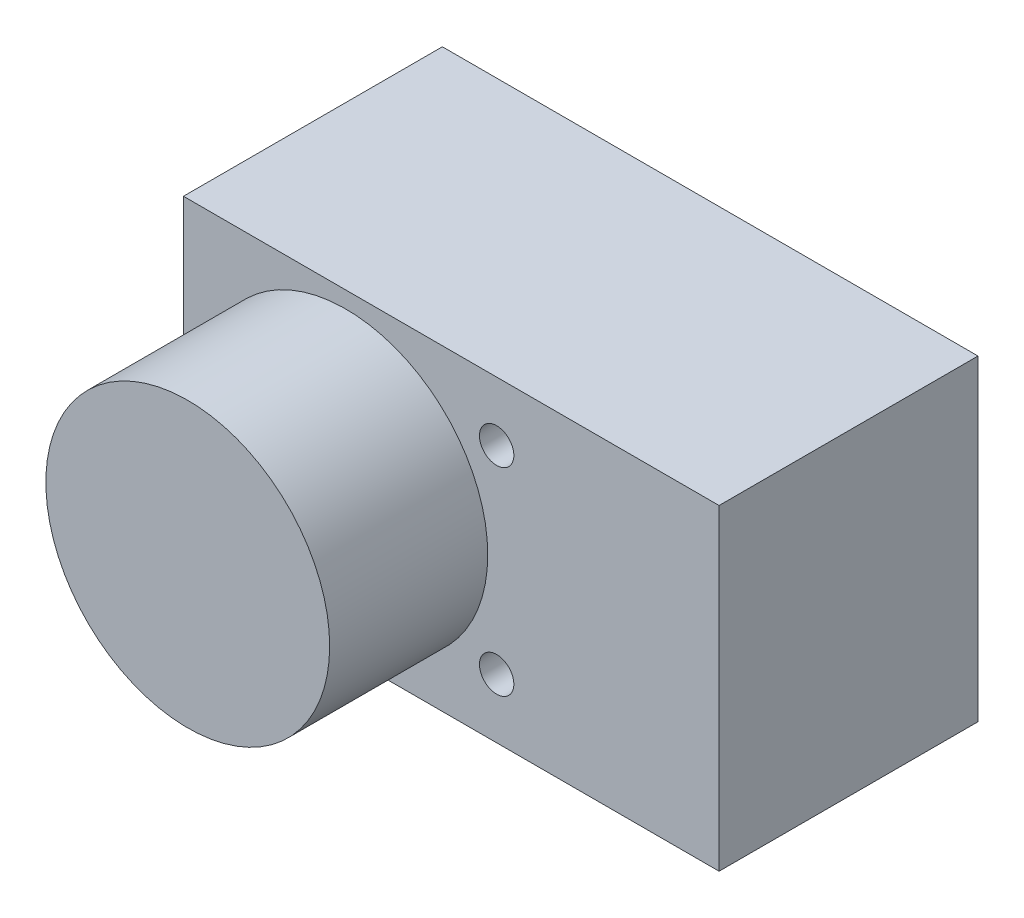
ISO-10303-21;
HEADER;
FILE_DESCRIPTION(('STEP AP214'),'2;1');
FILE_NAME('part.step','',(''),(''),'','','');
FILE_SCHEMA(('AUTOMOTIVE_DESIGN { 1 0 10303 214 1 1 1 1 }'));
ENDSEC;
DATA;
#1=APPLICATION_CONTEXT('core data for automotive mechanical design processes');
#2=APPLICATION_PROTOCOL_DEFINITION('international standard','automotive_design',2000,#1);
#3=PRODUCT_CONTEXT('',#1,'mechanical');
#4=PRODUCT('Part','Part','',(#3));
#5=PRODUCT_RELATED_PRODUCT_CATEGORY('part','',(#4));
#6=PRODUCT_DEFINITION_FORMATION('','',#4);
#7=PRODUCT_DEFINITION_CONTEXT('part definition',#1,'design');
#8=PRODUCT_DEFINITION('design','',#6,#7);
#9=PRODUCT_DEFINITION_SHAPE('','',#8);
#10=(LENGTH_UNIT() NAMED_UNIT(*) SI_UNIT(.MILLI.,.METRE.));
#11=(NAMED_UNIT(*) PLANE_ANGLE_UNIT() SI_UNIT($,.RADIAN.));
#12=(NAMED_UNIT(*) SI_UNIT($,.STERADIAN.) SOLID_ANGLE_UNIT());
#13=UNCERTAINTY_MEASURE_WITH_UNIT(LENGTH_MEASURE(1.E-05),#10,'distance_accuracy_value','');
#14=(GEOMETRIC_REPRESENTATION_CONTEXT(3) GLOBAL_UNCERTAINTY_ASSIGNED_CONTEXT((#13)) GLOBAL_UNIT_ASSIGNED_CONTEXT((#10,
#11,#12)) REPRESENTATION_CONTEXT('',''));
#15=CARTESIAN_POINT('',(0.,0.,0.));
#16=DIRECTION('',(0.,0.,1.));
#17=DIRECTION('',(1.,0.,0.));
#18=AXIS2_PLACEMENT_3D('',#15,#16,#17);
#19=CARTESIAN_POINT('',(11.2522,13.5636,-1.2954));
#20=DIRECTION('',(0.,0.,-1.));
#21=DIRECTION('',(-1.,0.,0.));
#22=AXIS2_PLACEMENT_3D('',#19,#20,#21);
#23=PLANE('',#22);
#24=CARTESIAN_POINT('',(11.2522,13.5636,-1.2954));
#25=DIRECTION('',(0.,0.,-1.));
#26=DIRECTION('',(-1.,0.,0.));
#27=AXIS2_PLACEMENT_3D('',#24,#25,#26);
#28=CIRCLE('',#27,8.9662);
#29=CARTESIAN_POINT('',(2.286,13.5636,-1.2954));
#30=VERTEX_POINT('',#29);
#31=EDGE_CURVE('E113',#30,#30,#28,.T.);
#32=ORIENTED_EDGE('',*,*,#31,.T.);
#33=EDGE_LOOP('',(#32));
#34=FACE_BOUND('',#33,.T.);
#35=CARTESIAN_POINT('',(11.2522,13.5636,-1.2954));
#36=DIRECTION('',(0.,0.,-1.));
#37=DIRECTION('',(-1.,0.,0.));
#38=AXIS2_PLACEMENT_3D('',#35,#36,#37);
#39=CIRCLE('',#38,3.4163);
#40=CARTESIAN_POINT('',(13.7909614480293,15.8496,-1.2954));
#41=VERTEX_POINT('',#40);
#42=CARTESIAN_POINT('',(13.7909614480293,11.2776,-1.2954));
#43=VERTEX_POINT('',#42);
#44=EDGE_CURVE('E134',#41,#43,#39,.T.);
#45=ORIENTED_EDGE('',*,*,#44,.F.);
#46=DIRECTION('',(-1.,0.,0.));
#47=VECTOR('',#46,1.);
#48=CARTESIAN_POINT('',(0.,15.8496,-1.2954));
#49=LINE('',#48,#47);
#50=CARTESIAN_POINT('',(8.71343855197066,15.8496,-1.2954));
#51=VERTEX_POINT('',#50);
#52=EDGE_CURVE('E56',#41,#51,#49,.T.);
#53=ORIENTED_EDGE('',*,*,#52,.T.);
#54=CARTESIAN_POINT('',(8.71343855197066,11.2776,-1.2954));
#55=VERTEX_POINT('',#54);
#56=EDGE_CURVE('E61',#55,#51,#39,.T.);
#57=ORIENTED_EDGE('',*,*,#56,.F.);
#58=DIRECTION('',(-1.,0.,0.));
#59=VECTOR('',#58,1.);
#60=CARTESIAN_POINT('',(0.,11.2776,-1.2954));
#61=LINE('',#60,#59);
#62=EDGE_CURVE('E132',#43,#55,#61,.T.);
#63=ORIENTED_EDGE('',*,*,#62,.F.);
#64=EDGE_LOOP('',(#45,#53,#57,#63));
#65=FACE_BOUND('',#64,.T.);
#66=ADVANCED_FACE('F38',(#34,#65),#23,.T.);
#67=CARTESIAN_POINT('',(0.,0.,22.1742));
#68=DIRECTION('',(1.,0.,0.));
#69=DIRECTION('',(0.,0.,-1.));
#70=AXIS2_PLACEMENT_3D('',#67,#68,#69);
#71=PLANE('',#70);
#72=DIRECTION('',(0.,-1.,0.));
#73=VECTOR('',#72,1.);
#74=CARTESIAN_POINT('',(0.,0.,0.));
#75=LINE('',#74,#73);
#76=CARTESIAN_POINT('',(0.,27.1272,0.));
#77=VERTEX_POINT('',#76);
#78=CARTESIAN_POINT('',(0.,0.,0.));
#79=VERTEX_POINT('',#78);
#80=EDGE_CURVE('E162',#77,#79,#75,.T.);
#81=ORIENTED_EDGE('',*,*,#80,.T.);
#82=DIRECTION('',(0.,0.,-1.));
#83=VECTOR('',#82,1.);
#84=CARTESIAN_POINT('',(0.,0.,22.1742));
#85=LINE('',#84,#83);
#86=CARTESIAN_POINT('',(0.,0.,22.1742));
#87=VERTEX_POINT('',#86);
#88=EDGE_CURVE('E166',#87,#79,#85,.T.);
#89=ORIENTED_EDGE('',*,*,#88,.F.);
#90=DIRECTION('',(0.,-1.,0.));
#91=VECTOR('',#90,1.);
#92=CARTESIAN_POINT('',(0.,0.,22.1742));
#93=LINE('',#92,#91);
#94=CARTESIAN_POINT('',(0.,27.1272,22.1742));
#95=VERTEX_POINT('',#94);
#96=EDGE_CURVE('E167',#95,#87,#93,.T.);
#97=ORIENTED_EDGE('',*,*,#96,.F.);
#98=DIRECTION('',(0.,0.,-1.));
#99=VECTOR('',#98,1.);
#100=CARTESIAN_POINT('',(0.,27.1272,22.1742));
#101=LINE('',#100,#99);
#102=EDGE_CURVE('E181',#95,#77,#101,.T.);
#103=ORIENTED_EDGE('',*,*,#102,.T.);
#104=EDGE_LOOP('',(#81,#89,#97,#103));
#105=FACE_BOUND('',#104,.T.);
#106=ADVANCED_FACE('F40',(#105),#71,.F.);
#107=CARTESIAN_POINT('',(0.,0.,22.1742));
#108=DIRECTION('',(0.,1.,0.));
#109=DIRECTION('',(0.,0.,1.));
#110=AXIS2_PLACEMENT_3D('',#107,#108,#109);
#111=PLANE('',#110);
#112=DIRECTION('',(1.,0.,0.));
#113=VECTOR('',#112,1.);
#114=CARTESIAN_POINT('',(0.,0.,0.));
#115=LINE('',#114,#113);
#116=CARTESIAN_POINT('',(45.8724,0.,0.));
#117=VERTEX_POINT('',#116);
#118=EDGE_CURVE('E185',#79,#117,#115,.T.);
#119=ORIENTED_EDGE('',*,*,#118,.T.);
#120=DIRECTION('',(0.,0.,-1.));
#121=VECTOR('',#120,1.);
#122=CARTESIAN_POINT('',(45.8724,0.,22.1742));
#123=LINE('',#122,#121);
#124=CARTESIAN_POINT('',(45.8724,0.,22.1742));
#125=VERTEX_POINT('',#124);
#126=EDGE_CURVE('E200',#125,#117,#123,.T.);
#127=ORIENTED_EDGE('',*,*,#126,.F.);
#128=DIRECTION('',(1.,0.,0.));
#129=VECTOR('',#128,1.);
#130=CARTESIAN_POINT('',(0.,0.,22.1742));
#131=LINE('',#130,#129);
#132=EDGE_CURVE('E171',#87,#125,#131,.T.);
#133=ORIENTED_EDGE('',*,*,#132,.F.);
#134=ORIENTED_EDGE('',*,*,#88,.T.);
#135=EDGE_LOOP('',(#119,#127,#133,#134));
#136=FACE_BOUND('',#135,.T.);
#137=ADVANCED_FACE('F207',(#136),#111,.F.);
#138=CARTESIAN_POINT('',(45.8724,0.,22.1742));
#139=DIRECTION('',(-1.,0.,0.));
#140=DIRECTION('',(0.,0.,1.));
#141=AXIS2_PLACEMENT_3D('',#138,#139,#140);
#142=PLANE('',#141);
#143=DIRECTION('',(0.,1.,0.));
#144=VECTOR('',#143,1.);
#145=CARTESIAN_POINT('',(45.8724,0.,0.));
#146=LINE('',#145,#144);
#147=CARTESIAN_POINT('',(45.8724,27.1272,0.));
#148=VERTEX_POINT('',#147);
#149=EDGE_CURVE('E188',#117,#148,#146,.T.);
#150=ORIENTED_EDGE('',*,*,#149,.T.);
#151=DIRECTION('',(0.,0.,-1.));
#152=VECTOR('',#151,1.);
#153=CARTESIAN_POINT('',(45.8724,27.1272,22.1742));
#154=LINE('',#153,#152);
#155=CARTESIAN_POINT('',(45.8724,27.1272,22.1742));
#156=VERTEX_POINT('',#155);
#157=EDGE_CURVE('E196',#156,#148,#154,.T.);
#158=ORIENTED_EDGE('',*,*,#157,.F.);
#159=DIRECTION('',(0.,1.,0.));
#160=VECTOR('',#159,1.);
#161=CARTESIAN_POINT('',(45.8724,0.,22.1742));
#162=LINE('',#161,#160);
#163=EDGE_CURVE('E175',#125,#156,#162,.T.);
#164=ORIENTED_EDGE('',*,*,#163,.F.);
#165=ORIENTED_EDGE('',*,*,#126,.T.);
#166=EDGE_LOOP('',(#150,#158,#164,#165));
#167=FACE_BOUND('',#166,.T.);
#168=ADVANCED_FACE('F219',(#167),#142,.F.);
#169=CARTESIAN_POINT('',(0.,27.1272,22.1742));
#170=DIRECTION('',(0.,-1.,0.));
#171=DIRECTION('',(0.,0.,-1.));
#172=AXIS2_PLACEMENT_3D('',#169,#170,#171);
#173=PLANE('',#172);
#174=DIRECTION('',(-1.,0.,0.));
#175=VECTOR('',#174,1.);
#176=CARTESIAN_POINT('',(0.,27.1272,0.));
#177=LINE('',#176,#175);
#178=EDGE_CURVE('E172',#148,#77,#177,.T.);
#179=ORIENTED_EDGE('',*,*,#178,.T.);
#180=ORIENTED_EDGE('',*,*,#102,.F.);
#181=DIRECTION('',(-1.,0.,0.));
#182=VECTOR('',#181,1.);
#183=CARTESIAN_POINT('',(0.,27.1272,22.1742));
#184=LINE('',#183,#182);
#185=EDGE_CURVE('E178',#156,#95,#184,.T.);
#186=ORIENTED_EDGE('',*,*,#185,.F.);
#187=ORIENTED_EDGE('',*,*,#157,.T.);
#188=EDGE_LOOP('',(#179,#180,#186,#187));
#189=FACE_BOUND('',#188,.T.);
#190=ADVANCED_FACE('F223',(#189),#173,.F.);
#191=CARTESIAN_POINT('',(0.,0.,22.1742));
#192=DIRECTION('',(0.,0.,-1.));
#193=DIRECTION('',(-1.,0.,0.));
#194=AXIS2_PLACEMENT_3D('',#191,#192,#193);
#195=PLANE('',#194);
#196=CARTESIAN_POINT('',(26.8224,22.0472,22.1742));
#197=DIRECTION('',(0.,0.,-1.));
#198=DIRECTION('',(-1.,0.,0.));
#199=AXIS2_PLACEMENT_3D('',#196,#197,#198);
#200=CIRCLE('',#199,1.47319999999999);
#201=CARTESIAN_POINT('',(25.3492,22.0472,22.1742));
#202=VERTEX_POINT('',#201);
#203=EDGE_CURVE('E386',#202,#202,#200,.T.);
#204=ORIENTED_EDGE('',*,*,#203,.T.);
#205=EDGE_LOOP('',(#204));
#206=FACE_BOUND('',#205,.T.);
#207=CARTESIAN_POINT('',(26.8224,5.08,22.1742));
#208=DIRECTION('',(0.,0.,-1.));
#209=DIRECTION('',(-1.,0.,0.));
#210=AXIS2_PLACEMENT_3D('',#207,#208,#209);
#211=CIRCLE('',#210,1.47319999999999);
#212=CARTESIAN_POINT('',(25.3492,5.08,22.1742));
#213=VERTEX_POINT('',#212);
#214=EDGE_CURVE('E42',#213,#213,#211,.T.);
#215=ORIENTED_EDGE('',*,*,#214,.T.);
#216=EDGE_LOOP('',(#215));
#217=FACE_BOUND('',#216,.T.);
#218=CARTESIAN_POINT('',(13.9065,13.5636,22.1742));
#219=DIRECTION('',(0.,0.,1.));
#220=DIRECTION('',(1.,0.,0.));
#221=AXIS2_PLACEMENT_3D('',#218,#219,#220);
#222=CIRCLE('',#221,12.1539);
#223=CARTESIAN_POINT('',(26.0604,13.5636,22.1742));
#224=VERTEX_POINT('',#223);
#225=EDGE_CURVE('E48',#224,#224,#222,.T.);
#226=ORIENTED_EDGE('',*,*,#225,.F.);
#227=EDGE_LOOP('',(#226));
#228=FACE_BOUND('',#227,.T.);
#229=ORIENTED_EDGE('',*,*,#96,.T.);
#230=ORIENTED_EDGE('',*,*,#132,.T.);
#231=ORIENTED_EDGE('',*,*,#163,.T.);
#232=ORIENTED_EDGE('',*,*,#185,.T.);
#233=EDGE_LOOP('',(#229,#230,#231,#232));
#234=FACE_BOUND('',#233,.T.);
#235=ADVANCED_FACE('F225',(#206,#217,#228,#234),#195,.F.);
#236=CARTESIAN_POINT('',(0.,0.,0.));
#237=DIRECTION('',(0.,0.,-1.));
#238=DIRECTION('',(-1.,0.,0.));
#239=AXIS2_PLACEMENT_3D('',#236,#237,#238);
#240=PLANE('',#239);
#241=CARTESIAN_POINT('',(26.8224,22.0472,0.));
#242=DIRECTION('',(0.,0.,-1.));
#243=DIRECTION('',(-1.,0.,0.));
#244=AXIS2_PLACEMENT_3D('',#241,#242,#243);
#245=CIRCLE('',#244,1.47319999999999);
#246=CARTESIAN_POINT('',(25.3492,22.0472,0.));
#247=VERTEX_POINT('',#246);
#248=EDGE_CURVE('E384',#247,#247,#245,.T.);
#249=ORIENTED_EDGE('',*,*,#248,.F.);
#250=EDGE_LOOP('',(#249));
#251=FACE_BOUND('',#250,.T.);
#252=CARTESIAN_POINT('',(26.8224,5.08,0.));
#253=DIRECTION('',(0.,0.,-1.));
#254=DIRECTION('',(-1.,0.,0.));
#255=AXIS2_PLACEMENT_3D('',#252,#253,#254);
#256=CIRCLE('',#255,1.47319999999999);
#257=CARTESIAN_POINT('',(25.3492,5.08,0.));
#258=VERTEX_POINT('',#257);
#259=EDGE_CURVE('E136',#258,#258,#256,.T.);
#260=ORIENTED_EDGE('',*,*,#259,.F.);
#261=EDGE_LOOP('',(#260));
#262=FACE_BOUND('',#261,.T.);
#263=CARTESIAN_POINT('',(11.2522,13.5636,0.));
#264=DIRECTION('',(0.,0.,-1.));
#265=DIRECTION('',(-1.,0.,0.));
#266=AXIS2_PLACEMENT_3D('',#263,#264,#265);
#267=CIRCLE('',#266,8.9662);
#268=CARTESIAN_POINT('',(2.286,13.5636,0.));
#269=VERTEX_POINT('',#268);
#270=EDGE_CURVE('E11',#269,#269,#267,.T.);
#271=ORIENTED_EDGE('',*,*,#270,.F.);
#272=EDGE_LOOP('',(#271));
#273=FACE_BOUND('',#272,.T.);
#274=ORIENTED_EDGE('',*,*,#80,.F.);
#275=ORIENTED_EDGE('',*,*,#178,.F.);
#276=ORIENTED_EDGE('',*,*,#149,.F.);
#277=ORIENTED_EDGE('',*,*,#118,.F.);
#278=EDGE_LOOP('',(#274,#275,#276,#277));
#279=FACE_BOUND('',#278,.T.);
#280=ADVANCED_FACE('F215',(#251,#262,#273,#279),#240,.T.);
#281=CARTESIAN_POINT('',(13.9065,13.5636,35.7124));
#282=DIRECTION('',(0.,0.,-1.));
#283=DIRECTION('',(-1.,0.,0.));
#284=AXIS2_PLACEMENT_3D('',#281,#282,#283);
#285=CYLINDRICAL_SURFACE('',#284,12.1539);
#286=CARTESIAN_POINT('',(13.9065,13.5636,35.7124));
#287=DIRECTION('',(0.,0.,1.));
#288=DIRECTION('',(1.,0.,0.));
#289=AXIS2_PLACEMENT_3D('',#286,#287,#288);
#290=CIRCLE('',#289,12.1539);
#291=CARTESIAN_POINT('',(26.0604,13.5636,35.7124));
#292=VERTEX_POINT('',#291);
#293=EDGE_CURVE('E157',#292,#292,#290,.T.);
#294=ORIENTED_EDGE('',*,*,#293,.F.);
#295=EDGE_LOOP('',(#294));
#296=FACE_BOUND('',#295,.T.);
#297=ORIENTED_EDGE('',*,*,#225,.T.);
#298=EDGE_LOOP('',(#297));
#299=FACE_BOUND('',#298,.T.);
#300=ADVANCED_FACE('F233',(#296,#299),#285,.T.);
#301=CARTESIAN_POINT('',(13.9065,13.5636,35.7124));
#302=DIRECTION('',(0.,0.,1.));
#303=DIRECTION('',(1.,0.,0.));
#304=AXIS2_PLACEMENT_3D('',#301,#302,#303);
#305=PLANE('',#304);
#306=ORIENTED_EDGE('',*,*,#293,.T.);
#307=EDGE_LOOP('',(#306));
#308=FACE_BOUND('',#307,.T.);
#309=ADVANCED_FACE('F253',(#308),#305,.T.);
#310=CARTESIAN_POINT('',(11.2522,13.5636,-1.2954));
#311=DIRECTION('',(0.,0.,1.));
#312=DIRECTION('',(1.,0.,0.));
#313=AXIS2_PLACEMENT_3D('',#310,#311,#312);
#314=CYLINDRICAL_SURFACE('',#313,8.9662);
#315=ORIENTED_EDGE('',*,*,#31,.F.);
#316=EDGE_LOOP('',(#315));
#317=FACE_BOUND('',#316,.T.);
#318=ORIENTED_EDGE('',*,*,#270,.T.);
#319=EDGE_LOOP('',(#318));
#320=FACE_BOUND('',#319,.T.);
#321=ADVANCED_FACE('F250',(#317,#320),#314,.T.);
#322=CARTESIAN_POINT('',(0.,15.8496,-7.0104));
#323=DIRECTION('',(0.,1.,0.));
#324=DIRECTION('',(0.,0.,1.));
#325=AXIS2_PLACEMENT_3D('',#322,#323,#324);
#326=PLANE('',#325);
#327=ORIENTED_EDGE('',*,*,#52,.F.);
#328=DIRECTION('',(0.,0.,1.));
#329=VECTOR('',#328,1.);
#330=CARTESIAN_POINT('',(13.7909614480293,15.8496,-7.0104));
#331=LINE('',#330,#329);
#332=CARTESIAN_POINT('',(13.7909614480293,15.8496,-7.0104));
#333=VERTEX_POINT('',#332);
#334=EDGE_CURVE('E105',#333,#41,#331,.T.);
#335=ORIENTED_EDGE('',*,*,#334,.F.);
#336=DIRECTION('',(-1.,0.,0.));
#337=VECTOR('',#336,1.);
#338=CARTESIAN_POINT('',(0.,15.8496,-7.0104));
#339=LINE('',#338,#337);
#340=CARTESIAN_POINT('',(8.71343855197066,15.8496,-7.0104));
#341=VERTEX_POINT('',#340);
#342=EDGE_CURVE('E109',#333,#341,#339,.T.);
#343=ORIENTED_EDGE('',*,*,#342,.T.);
#344=DIRECTION('',(0.,0.,1.));
#345=VECTOR('',#344,1.);
#346=CARTESIAN_POINT('',(8.71343855197066,15.8496,-7.0104));
#347=LINE('',#346,#345);
#348=EDGE_CURVE('E146',#341,#51,#347,.T.);
#349=ORIENTED_EDGE('',*,*,#348,.T.);
#350=EDGE_LOOP('',(#327,#335,#343,#349));
#351=FACE_BOUND('',#350,.T.);
#352=ADVANCED_FACE('F107',(#351),#326,.T.);
#353=CARTESIAN_POINT('',(11.2522,13.5636,-7.0104));
#354=DIRECTION('',(0.,0.,1.));
#355=DIRECTION('',(1.,0.,0.));
#356=AXIS2_PLACEMENT_3D('',#353,#354,#355);
#357=CYLINDRICAL_SURFACE('',#356,3.4163);
#358=ORIENTED_EDGE('',*,*,#44,.T.);
#359=DIRECTION('',(0.,0.,1.));
#360=VECTOR('',#359,1.);
#361=CARTESIAN_POINT('',(13.7909614480293,11.2776,-7.0104));
#362=LINE('',#361,#360);
#363=CARTESIAN_POINT('',(13.7909614480293,11.2776,-7.0104));
#364=VERTEX_POINT('',#363);
#365=EDGE_CURVE('E114',#364,#43,#362,.T.);
#366=ORIENTED_EDGE('',*,*,#365,.F.);
#367=CARTESIAN_POINT('',(11.2522,13.5636,-7.0104));
#368=DIRECTION('',(0.,0.,-1.));
#369=DIRECTION('',(-1.,0.,0.));
#370=AXIS2_PLACEMENT_3D('',#367,#368,#369);
#371=CIRCLE('',#370,3.4163);
#372=EDGE_CURVE('E117',#333,#364,#371,.T.);
#373=ORIENTED_EDGE('',*,*,#372,.F.);
#374=ORIENTED_EDGE('',*,*,#334,.T.);
#375=EDGE_LOOP('',(#358,#366,#373,#374));
#376=FACE_BOUND('',#375,.T.);
#377=ADVANCED_FACE('F118',(#376),#357,.T.);
#378=CARTESIAN_POINT('',(0.,11.2776,-7.0104));
#379=DIRECTION('',(0.,1.,0.));
#380=DIRECTION('',(0.,0.,1.));
#381=AXIS2_PLACEMENT_3D('',#378,#379,#380);
#382=PLANE('',#381);
#383=ORIENTED_EDGE('',*,*,#62,.T.);
#384=DIRECTION('',(0.,0.,1.));
#385=VECTOR('',#384,1.);
#386=CARTESIAN_POINT('',(8.71343855197066,11.2776,-7.0104));
#387=LINE('',#386,#385);
#388=CARTESIAN_POINT('',(8.71343855197066,11.2776,-7.0104));
#389=VERTEX_POINT('',#388);
#390=EDGE_CURVE('E149',#389,#55,#387,.T.);
#391=ORIENTED_EDGE('',*,*,#390,.F.);
#392=DIRECTION('',(-1.,0.,0.));
#393=VECTOR('',#392,1.);
#394=CARTESIAN_POINT('',(0.,11.2776,-7.0104));
#395=LINE('',#394,#393);
#396=EDGE_CURVE('E123',#364,#389,#395,.T.);
#397=ORIENTED_EDGE('',*,*,#396,.F.);
#398=ORIENTED_EDGE('',*,*,#365,.T.);
#399=EDGE_LOOP('',(#383,#391,#397,#398));
#400=FACE_BOUND('',#399,.T.);
#401=ADVANCED_FACE('F288',(#400),#382,.F.);
#402=ORIENTED_EDGE('',*,*,#56,.T.);
#403=ORIENTED_EDGE('',*,*,#348,.F.);
#404=EDGE_CURVE('E125',#389,#341,#371,.T.);
#405=ORIENTED_EDGE('',*,*,#404,.F.);
#406=ORIENTED_EDGE('',*,*,#390,.T.);
#407=EDGE_LOOP('',(#402,#403,#405,#406));
#408=FACE_BOUND('',#407,.T.);
#409=ADVANCED_FACE('F290',(#408),#357,.T.);
#410=CARTESIAN_POINT('',(0.,0.,-7.0104));
#411=DIRECTION('',(0.,0.,-1.));
#412=DIRECTION('',(-1.,0.,0.));
#413=AXIS2_PLACEMENT_3D('',#410,#411,#412);
#414=PLANE('',#413);
#415=ORIENTED_EDGE('',*,*,#342,.F.);
#416=ORIENTED_EDGE('',*,*,#372,.T.);
#417=ORIENTED_EDGE('',*,*,#396,.T.);
#418=ORIENTED_EDGE('',*,*,#404,.T.);
#419=EDGE_LOOP('',(#415,#416,#417,#418));
#420=FACE_BOUND('',#419,.T.);
#421=ADVANCED_FACE('F126',(#420),#414,.T.);
#422=CARTESIAN_POINT('',(26.8224,5.08,0.));
#423=DIRECTION('',(0.,0.,-1.));
#424=DIRECTION('',(-1.,0.,0.));
#425=AXIS2_PLACEMENT_3D('',#422,#423,#424);
#426=CYLINDRICAL_SURFACE('',#425,1.47319999999999);
#427=ORIENTED_EDGE('',*,*,#259,.T.);
#428=EDGE_LOOP('',(#427));
#429=FACE_BOUND('',#428,.T.);
#430=ORIENTED_EDGE('',*,*,#214,.F.);
#431=EDGE_LOOP('',(#430));
#432=FACE_BOUND('',#431,.T.);
#433=ADVANCED_FACE('F307',(#429,#432),#426,.F.);
#434=CARTESIAN_POINT('',(26.8224,22.0472,0.));
#435=DIRECTION('',(0.,0.,-1.));
#436=DIRECTION('',(-1.,0.,0.));
#437=AXIS2_PLACEMENT_3D('',#434,#435,#436);
#438=CYLINDRICAL_SURFACE('',#437,1.47319999999999);
#439=ORIENTED_EDGE('',*,*,#248,.T.);
#440=EDGE_LOOP('',(#439));
#441=FACE_BOUND('',#440,.T.);
#442=ORIENTED_EDGE('',*,*,#203,.F.);
#443=EDGE_LOOP('',(#442));
#444=FACE_BOUND('',#443,.T.);
#445=ADVANCED_FACE('F314',(#441,#444),#438,.F.);
#446=CLOSED_SHELL('',(#66,#106,#137,#168,#190,#235,#280,#300,#309,#321,#352,#377,#401,#409,#421,
#433,#445));
#447=MANIFOLD_SOLID_BREP('B2',#446);
#448=ADVANCED_BREP_SHAPE_REPRESENTATION('',(#18,#447),#14);
#449=SHAPE_DEFINITION_REPRESENTATION(#9,#448);
ENDSEC;
END-ISO-10303-21;
